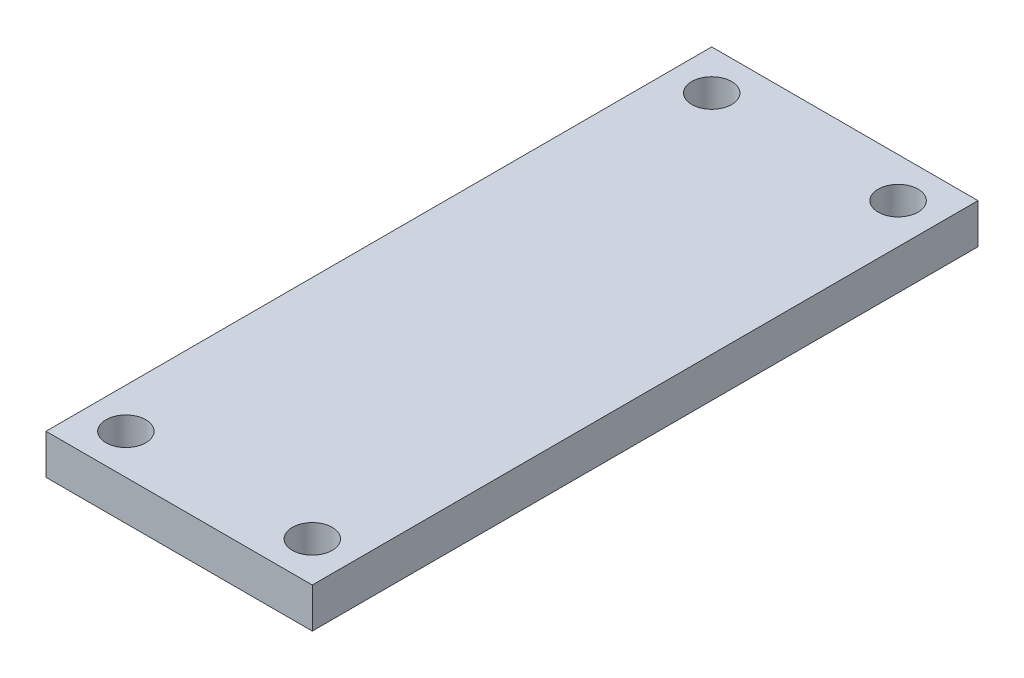
ISO-10303-21;
HEADER;
FILE_DESCRIPTION(('STEP AP214'),'2;1');
FILE_NAME('part.step','',(''),(''),'','','');
FILE_SCHEMA(('AUTOMOTIVE_DESIGN { 1 0 10303 214 1 1 1 1 }'));
ENDSEC;
DATA;
#1=APPLICATION_CONTEXT('core data for automotive mechanical design processes');
#2=APPLICATION_PROTOCOL_DEFINITION('international standard','automotive_design',2000,#1);
#3=PRODUCT_CONTEXT('',#1,'mechanical');
#4=PRODUCT('Part','Part','',(#3));
#5=PRODUCT_RELATED_PRODUCT_CATEGORY('part','',(#4));
#6=PRODUCT_DEFINITION_FORMATION('','',#4);
#7=PRODUCT_DEFINITION_CONTEXT('part definition',#1,'design');
#8=PRODUCT_DEFINITION('design','',#6,#7);
#9=PRODUCT_DEFINITION_SHAPE('','',#8);
#10=(LENGTH_UNIT() NAMED_UNIT(*) SI_UNIT(.MILLI.,.METRE.));
#11=(NAMED_UNIT(*) PLANE_ANGLE_UNIT() SI_UNIT($,.RADIAN.));
#12=(NAMED_UNIT(*) SI_UNIT($,.STERADIAN.) SOLID_ANGLE_UNIT());
#13=UNCERTAINTY_MEASURE_WITH_UNIT(LENGTH_MEASURE(1.E-05),#10,'distance_accuracy_value','');
#14=(GEOMETRIC_REPRESENTATION_CONTEXT(3) GLOBAL_UNCERTAINTY_ASSIGNED_CONTEXT((#13)) GLOBAL_UNIT_ASSIGNED_CONTEXT((#10,
#11,#12)) REPRESENTATION_CONTEXT('',''));
#15=CARTESIAN_POINT('',(0.,0.,0.));
#16=DIRECTION('',(0.,0.,1.));
#17=DIRECTION('',(1.,0.,0.));
#18=AXIS2_PLACEMENT_3D('',#15,#16,#17);
#19=CARTESIAN_POINT('',(-10.,1.5,25.));
#20=DIRECTION('',(0.,0.,-1.));
#21=DIRECTION('',(-1.,0.,0.));
#22=AXIS2_PLACEMENT_3D('',#19,#20,#21);
#23=PLANE('',#22);
#24=DIRECTION('',(1.,0.,0.));
#25=VECTOR('',#24,1.);
#26=CARTESIAN_POINT('',(-10.,-1.5,25.));
#27=LINE('',#26,#25);
#28=CARTESIAN_POINT('',(-10.,-1.5,25.));
#29=VERTEX_POINT('',#28);
#30=CARTESIAN_POINT('',(10.,-1.5,25.));
#31=VERTEX_POINT('',#30);
#32=EDGE_CURVE('E100',#29,#31,#27,.T.);
#33=ORIENTED_EDGE('',*,*,#32,.T.);
#34=DIRECTION('',(0.,-1.,0.));
#35=VECTOR('',#34,1.);
#36=CARTESIAN_POINT('',(10.,1.5,25.));
#37=LINE('',#36,#35);
#38=CARTESIAN_POINT('',(10.,1.5,25.));
#39=VERTEX_POINT('',#38);
#40=EDGE_CURVE('E11',#39,#31,#37,.T.);
#41=ORIENTED_EDGE('',*,*,#40,.F.);
#42=DIRECTION('',(1.,0.,0.));
#43=VECTOR('',#42,1.);
#44=CARTESIAN_POINT('',(-10.,1.5,25.));
#45=LINE('',#44,#43);
#46=CARTESIAN_POINT('',(-10.,1.5,25.));
#47=VERTEX_POINT('',#46);
#48=EDGE_CURVE('E86',#47,#39,#45,.T.);
#49=ORIENTED_EDGE('',*,*,#48,.F.);
#50=DIRECTION('',(0.,-1.,0.));
#51=VECTOR('',#50,1.);
#52=CARTESIAN_POINT('',(-10.,1.5,25.));
#53=LINE('',#52,#51);
#54=EDGE_CURVE('E53',#47,#29,#53,.T.);
#55=ORIENTED_EDGE('',*,*,#54,.T.);
#56=EDGE_LOOP('',(#33,#41,#49,#55));
#57=FACE_BOUND('',#56,.T.);
#58=ADVANCED_FACE('F37',(#57),#23,.F.);
#59=CARTESIAN_POINT('',(10.,1.5,25.));
#60=DIRECTION('',(-1.,0.,0.));
#61=DIRECTION('',(0.,0.,1.));
#62=AXIS2_PLACEMENT_3D('',#59,#60,#61);
#63=PLANE('',#62);
#64=DIRECTION('',(0.,0.,-1.));
#65=VECTOR('',#64,1.);
#66=CARTESIAN_POINT('',(10.,-1.5,25.));
#67=LINE('',#66,#65);
#68=CARTESIAN_POINT('',(10.,-1.5,-25.));
#69=VERTEX_POINT('',#68);
#70=EDGE_CURVE('E91',#31,#69,#67,.T.);
#71=ORIENTED_EDGE('',*,*,#70,.T.);
#72=DIRECTION('',(0.,-1.,0.));
#73=VECTOR('',#72,1.);
#74=CARTESIAN_POINT('',(10.,1.5,-25.));
#75=LINE('',#74,#73);
#76=CARTESIAN_POINT('',(10.,1.5,-25.));
#77=VERTEX_POINT('',#76);
#78=EDGE_CURVE('E45',#77,#69,#75,.T.);
#79=ORIENTED_EDGE('',*,*,#78,.F.);
#80=DIRECTION('',(0.,0.,-1.));
#81=VECTOR('',#80,1.);
#82=CARTESIAN_POINT('',(10.,1.5,25.));
#83=LINE('',#82,#81);
#84=EDGE_CURVE('E78',#39,#77,#83,.T.);
#85=ORIENTED_EDGE('',*,*,#84,.F.);
#86=ORIENTED_EDGE('',*,*,#40,.T.);
#87=EDGE_LOOP('',(#71,#79,#85,#86));
#88=FACE_BOUND('',#87,.T.);
#89=ADVANCED_FACE('F90',(#88),#63,.F.);
#90=CARTESIAN_POINT('',(-10.,1.5,-25.));
#91=DIRECTION('',(0.,0.,-1.));
#92=DIRECTION('',(-1.,0.,0.));
#93=AXIS2_PLACEMENT_3D('',#90,#91,#92);
#94=PLANE('',#93);
#95=DIRECTION('',(1.,0.,0.));
#96=VECTOR('',#95,1.);
#97=CARTESIAN_POINT('',(-10.,-1.5,-25.));
#98=LINE('',#97,#96);
#99=CARTESIAN_POINT('',(-10.,-1.5,-25.));
#100=VERTEX_POINT('',#99);
#101=EDGE_CURVE('E104',#100,#69,#98,.T.);
#102=ORIENTED_EDGE('',*,*,#101,.F.);
#103=DIRECTION('',(0.,-1.,0.));
#104=VECTOR('',#103,1.);
#105=CARTESIAN_POINT('',(-10.,1.5,-25.));
#106=LINE('',#105,#104);
#107=CARTESIAN_POINT('',(-10.,1.5,-25.));
#108=VERTEX_POINT('',#107);
#109=EDGE_CURVE('E67',#108,#100,#106,.T.);
#110=ORIENTED_EDGE('',*,*,#109,.F.);
#111=DIRECTION('',(1.,0.,0.));
#112=VECTOR('',#111,1.);
#113=CARTESIAN_POINT('',(-10.,1.5,-25.));
#114=LINE('',#113,#112);
#115=EDGE_CURVE('E85',#108,#77,#114,.T.);
#116=ORIENTED_EDGE('',*,*,#115,.T.);
#117=ORIENTED_EDGE('',*,*,#78,.T.);
#118=EDGE_LOOP('',(#102,#110,#116,#117));
#119=FACE_BOUND('',#118,.T.);
#120=ADVANCED_FACE('F94',(#119),#94,.T.);
#121=CARTESIAN_POINT('',(-10.,1.5,25.));
#122=DIRECTION('',(-1.,0.,0.));
#123=DIRECTION('',(0.,0.,1.));
#124=AXIS2_PLACEMENT_3D('',#121,#122,#123);
#125=PLANE('',#124);
#126=DIRECTION('',(0.,0.,-1.));
#127=VECTOR('',#126,1.);
#128=CARTESIAN_POINT('',(-10.,-1.5,25.));
#129=LINE('',#128,#127);
#130=EDGE_CURVE('E106',#29,#100,#129,.T.);
#131=ORIENTED_EDGE('',*,*,#130,.F.);
#132=ORIENTED_EDGE('',*,*,#54,.F.);
#133=DIRECTION('',(0.,0.,-1.));
#134=VECTOR('',#133,1.);
#135=CARTESIAN_POINT('',(-10.,1.5,25.));
#136=LINE('',#135,#134);
#137=EDGE_CURVE('E95',#47,#108,#136,.T.);
#138=ORIENTED_EDGE('',*,*,#137,.T.);
#139=ORIENTED_EDGE('',*,*,#109,.T.);
#140=EDGE_LOOP('',(#131,#132,#138,#139));
#141=FACE_BOUND('',#140,.T.);
#142=ADVANCED_FACE('F145',(#141),#125,.T.);
#143=CARTESIAN_POINT('',(0.,1.5,0.));
#144=DIRECTION('',(0.,1.,0.));
#145=DIRECTION('',(0.,0.,1.));
#146=AXIS2_PLACEMENT_3D('',#143,#144,#145);
#147=PLANE('',#146);
#148=CARTESIAN_POINT('',(-7.,1.5,-22.));
#149=DIRECTION('',(0.,1.,0.));
#150=DIRECTION('',(0.,0.,1.));
#151=AXIS2_PLACEMENT_3D('',#148,#149,#150);
#152=CIRCLE('',#151,1.5);
#153=CARTESIAN_POINT('',(-7.,1.5,-20.5));
#154=VERTEX_POINT('',#153);
#155=EDGE_CURVE('E118',#154,#154,#152,.T.);
#156=ORIENTED_EDGE('',*,*,#155,.F.);
#157=EDGE_LOOP('',(#156));
#158=FACE_BOUND('',#157,.T.);
#159=CARTESIAN_POINT('',(7.,1.5,-22.));
#160=DIRECTION('',(0.,1.,0.));
#161=DIRECTION('',(0.,0.,1.));
#162=AXIS2_PLACEMENT_3D('',#159,#160,#161);
#163=CIRCLE('',#162,1.5);
#164=CARTESIAN_POINT('',(7.,1.5,-20.5));
#165=VERTEX_POINT('',#164);
#166=EDGE_CURVE('E125',#165,#165,#163,.T.);
#167=ORIENTED_EDGE('',*,*,#166,.F.);
#168=EDGE_LOOP('',(#167));
#169=FACE_BOUND('',#168,.T.);
#170=CARTESIAN_POINT('',(7.,1.5,22.));
#171=DIRECTION('',(0.,1.,0.));
#172=DIRECTION('',(0.,0.,1.));
#173=AXIS2_PLACEMENT_3D('',#170,#171,#172);
#174=CIRCLE('',#173,1.5);
#175=CARTESIAN_POINT('',(7.,1.5,23.5));
#176=VERTEX_POINT('',#175);
#177=EDGE_CURVE('E117',#176,#176,#174,.T.);
#178=ORIENTED_EDGE('',*,*,#177,.F.);
#179=EDGE_LOOP('',(#178));
#180=FACE_BOUND('',#179,.T.);
#181=CARTESIAN_POINT('',(-7.,1.5,22.));
#182=DIRECTION('',(0.,1.,0.));
#183=DIRECTION('',(0.,0.,1.));
#184=AXIS2_PLACEMENT_3D('',#181,#182,#183);
#185=CIRCLE('',#184,1.5);
#186=CARTESIAN_POINT('',(-7.,1.5,23.5));
#187=VERTEX_POINT('',#186);
#188=EDGE_CURVE('E114',#187,#187,#185,.T.);
#189=ORIENTED_EDGE('',*,*,#188,.F.);
#190=EDGE_LOOP('',(#189));
#191=FACE_BOUND('',#190,.T.);
#192=ORIENTED_EDGE('',*,*,#48,.T.);
#193=ORIENTED_EDGE('',*,*,#84,.T.);
#194=ORIENTED_EDGE('',*,*,#115,.F.);
#195=ORIENTED_EDGE('',*,*,#137,.F.);
#196=EDGE_LOOP('',(#192,#193,#194,#195));
#197=FACE_BOUND('',#196,.T.);
#198=ADVANCED_FACE('F82',(#158,#169,#180,#191,#197),#147,.T.);
#199=CARTESIAN_POINT('',(0.,-1.5,0.));
#200=DIRECTION('',(0.,1.,0.));
#201=DIRECTION('',(0.,0.,1.));
#202=AXIS2_PLACEMENT_3D('',#199,#200,#201);
#203=PLANE('',#202);
#204=CARTESIAN_POINT('',(-7.,-1.5,-22.));
#205=DIRECTION('',(0.,1.,0.));
#206=DIRECTION('',(0.,0.,1.));
#207=AXIS2_PLACEMENT_3D('',#204,#205,#206);
#208=CIRCLE('',#207,1.5);
#209=CARTESIAN_POINT('',(-7.,-1.5,-20.5));
#210=VERTEX_POINT('',#209);
#211=EDGE_CURVE('E122',#210,#210,#208,.F.);
#212=ORIENTED_EDGE('',*,*,#211,.F.);
#213=EDGE_LOOP('',(#212));
#214=FACE_BOUND('',#213,.T.);
#215=CARTESIAN_POINT('',(7.,-1.5,-22.));
#216=DIRECTION('',(0.,1.,0.));
#217=DIRECTION('',(0.,0.,1.));
#218=AXIS2_PLACEMENT_3D('',#215,#216,#217);
#219=CIRCLE('',#218,1.5);
#220=CARTESIAN_POINT('',(7.,-1.5,-20.5));
#221=VERTEX_POINT('',#220);
#222=EDGE_CURVE('E121',#221,#221,#219,.F.);
#223=ORIENTED_EDGE('',*,*,#222,.F.);
#224=EDGE_LOOP('',(#223));
#225=FACE_BOUND('',#224,.T.);
#226=CARTESIAN_POINT('',(7.,-1.5,22.));
#227=DIRECTION('',(0.,1.,0.));
#228=DIRECTION('',(0.,0.,1.));
#229=AXIS2_PLACEMENT_3D('',#226,#227,#228);
#230=CIRCLE('',#229,1.5);
#231=CARTESIAN_POINT('',(7.,-1.5,23.5));
#232=VERTEX_POINT('',#231);
#233=EDGE_CURVE('E128',#232,#232,#230,.F.);
#234=ORIENTED_EDGE('',*,*,#233,.F.);
#235=EDGE_LOOP('',(#234));
#236=FACE_BOUND('',#235,.T.);
#237=CARTESIAN_POINT('',(-7.,-1.5,22.));
#238=DIRECTION('',(0.,1.,0.));
#239=DIRECTION('',(0.,0.,1.));
#240=AXIS2_PLACEMENT_3D('',#237,#238,#239);
#241=CIRCLE('',#240,1.5);
#242=CARTESIAN_POINT('',(-7.,-1.5,23.5));
#243=VERTEX_POINT('',#242);
#244=EDGE_CURVE('E102',#243,#243,#241,.F.);
#245=ORIENTED_EDGE('',*,*,#244,.F.);
#246=EDGE_LOOP('',(#245));
#247=FACE_BOUND('',#246,.T.);
#248=ORIENTED_EDGE('',*,*,#32,.F.);
#249=ORIENTED_EDGE('',*,*,#130,.T.);
#250=ORIENTED_EDGE('',*,*,#101,.T.);
#251=ORIENTED_EDGE('',*,*,#70,.F.);
#252=EDGE_LOOP('',(#248,#249,#250,#251));
#253=FACE_BOUND('',#252,.T.);
#254=ADVANCED_FACE('F138',(#214,#225,#236,#247,#253),#203,.F.);
#255=CARTESIAN_POINT('',(-7.,-1.501,22.));
#256=DIRECTION('',(0.,1.,0.));
#257=DIRECTION('',(0.,0.,1.));
#258=AXIS2_PLACEMENT_3D('',#255,#256,#257);
#259=CYLINDRICAL_SURFACE('',#258,1.5);
#260=CARTESIAN_POINT('',(-7.,1.5,23.5));
#261=CARTESIAN_POINT('',(-7.,1.46875,23.5));
#262=CARTESIAN_POINT('',(-7.,1.4375,23.5));
#263=CARTESIAN_POINT('',(-7.,1.375,23.5));
#264=CARTESIAN_POINT('',(-7.,1.34375,23.5));
#265=CARTESIAN_POINT('',(-7.,1.28125,23.5));
#266=CARTESIAN_POINT('',(-7.,1.25,23.5));
#267=CARTESIAN_POINT('',(-7.,1.1875,23.5));
#268=CARTESIAN_POINT('',(-7.,1.15625,23.5));
#269=CARTESIAN_POINT('',(-7.,1.09375,23.5));
#270=CARTESIAN_POINT('',(-7.,1.0625,23.5));
#271=CARTESIAN_POINT('',(-7.,1.,23.5));
#272=CARTESIAN_POINT('',(-7.,0.96875,23.5));
#273=CARTESIAN_POINT('',(-7.,0.90625,23.5));
#274=CARTESIAN_POINT('',(-7.,0.874999999999999,23.5));
#275=CARTESIAN_POINT('',(-7.,0.8125,23.5));
#276=CARTESIAN_POINT('',(-7.,0.78125,23.5));
#277=CARTESIAN_POINT('',(-7.,0.71875,23.5));
#278=CARTESIAN_POINT('',(-7.,0.6875,23.5));
#279=CARTESIAN_POINT('',(-7.,0.625,23.5));
#280=CARTESIAN_POINT('',(-7.,0.59375,23.5));
#281=CARTESIAN_POINT('',(-7.,0.53125,23.5));
#282=CARTESIAN_POINT('',(-7.,0.5,23.5));
#283=CARTESIAN_POINT('',(-7.,0.4375,23.5));
#284=CARTESIAN_POINT('',(-7.,0.40625,23.5));
#285=CARTESIAN_POINT('',(-7.,0.34375,23.5));
#286=CARTESIAN_POINT('',(-7.,0.3125,23.5));
#287=CARTESIAN_POINT('',(-7.,0.25,23.5));
#288=CARTESIAN_POINT('',(-7.,0.21875,23.5));
#289=CARTESIAN_POINT('',(-7.,0.15625,23.5));
#290=CARTESIAN_POINT('',(-7.,0.125,23.5));
#291=CARTESIAN_POINT('',(-7.,0.0624999999999998,23.5));
#292=CARTESIAN_POINT('',(-7.,0.0312499999999998,23.5));
#293=CARTESIAN_POINT('',(-7.,-0.0312500000000002,23.5));
#294=CARTESIAN_POINT('',(-7.,-0.0625000000000003,23.5));
#295=CARTESIAN_POINT('',(-7.,-0.125,23.5));
#296=CARTESIAN_POINT('',(-7.,-0.15625,23.5));
#297=CARTESIAN_POINT('',(-7.,-0.21875,23.5));
#298=CARTESIAN_POINT('',(-7.,-0.25,23.5));
#299=CARTESIAN_POINT('',(-7.,-0.3125,23.5));
#300=CARTESIAN_POINT('',(-7.,-0.34375,23.5));
#301=CARTESIAN_POINT('',(-7.,-0.40625,23.5));
#302=CARTESIAN_POINT('',(-7.,-0.4375,23.5));
#303=CARTESIAN_POINT('',(-7.,-0.5,23.5));
#304=CARTESIAN_POINT('',(-7.,-0.53125,23.5));
#305=CARTESIAN_POINT('',(-7.,-0.59375,23.5));
#306=CARTESIAN_POINT('',(-7.,-0.625,23.5));
#307=CARTESIAN_POINT('',(-7.,-0.6875,23.5));
#308=CARTESIAN_POINT('',(-7.,-0.71875,23.5));
#309=CARTESIAN_POINT('',(-7.,-0.78125,23.5));
#310=CARTESIAN_POINT('',(-7.,-0.8125,23.5));
#311=CARTESIAN_POINT('',(-7.,-0.875,23.5));
#312=CARTESIAN_POINT('',(-7.,-0.90625,23.5));
#313=CARTESIAN_POINT('',(-7.,-0.96875,23.5));
#314=CARTESIAN_POINT('',(-7.,-1.,23.5));
#315=CARTESIAN_POINT('',(-7.,-1.0625,23.5));
#316=CARTESIAN_POINT('',(-7.,-1.09375,23.5));
#317=CARTESIAN_POINT('',(-7.,-1.15625,23.5));
#318=CARTESIAN_POINT('',(-7.,-1.1875,23.5));
#319=CARTESIAN_POINT('',(-7.,-1.25,23.5));
#320=CARTESIAN_POINT('',(-7.,-1.28125,23.5));
#321=CARTESIAN_POINT('',(-7.,-1.34375,23.5));
#322=CARTESIAN_POINT('',(-7.,-1.375,23.5));
#323=CARTESIAN_POINT('',(-7.,-1.4375,23.5));
#324=CARTESIAN_POINT('',(-7.,-1.46875,23.5));
#325=CARTESIAN_POINT('',(-7.,-1.5,23.5));
#326=B_SPLINE_CURVE_WITH_KNOTS('',3,(#260,#261,#262,#263,#264,#265,#266,#267,#268,#269,#270,
#271,#272,#273,#274,#275,#276,#277,#278,#279,#280,#281,#282,#283,#284,#285,#286,#287,#288,#289,
#290,#291,#292,#293,#294,#295,#296,#297,#298,#299,#300,#301,#302,#303,#304,#305,#306,#307,#308,
#309,#310,#311,#312,#313,#314,#315,#316,#317,#318,#319,#320,#321,#322,#323,#324,#325),
.UNSPECIFIED.,.F.,.F.,(4,2,2,2,2,2,2,2,2,2,2,2,2,2,2,2,2,2,2,2,2,2,2,2,2,2,2,2,2,2,2,2,4),(0.,
0.0937500000000001,0.1875,0.28125,0.375,0.46875,0.5625,0.65625,0.75,0.84375,0.9375,1.03125,
1.125,1.21875,1.3125,1.40625,1.5,1.59375,1.6875,1.78125,1.875,1.96875,2.0625,2.15625,2.25,
2.34375,2.4375,2.53125,2.625,2.71875,2.8125,2.90625,3.),.UNSPECIFIED.);
#327=EDGE_CURVE('BSEAM141',#187,#243,#326,.T.);
#328=ORIENTED_EDGE('',*,*,#188,.T.);
#329=ORIENTED_EDGE('',*,*,#244,.T.);
#330=ORIENTED_EDGE('',*,*,#327,.T.);
#331=ORIENTED_EDGE('',*,*,#327,.F.);
#332=EDGE_LOOP('',(#328,#330,#329,#331));
#333=FACE_BOUND('',#332,.T.);
#334=ADVANCED_FACE('F141',(#333),#259,.F.);
#335=CARTESIAN_POINT('',(7.,-1.501,22.));
#336=DIRECTION('',(0.,1.,0.));
#337=DIRECTION('',(0.,0.,1.));
#338=AXIS2_PLACEMENT_3D('',#335,#336,#337);
#339=CYLINDRICAL_SURFACE('',#338,1.5);
#340=CARTESIAN_POINT('',(7.,1.5,23.5));
#341=CARTESIAN_POINT('',(7.,1.46875,23.5));
#342=CARTESIAN_POINT('',(7.,1.4375,23.5));
#343=CARTESIAN_POINT('',(7.,1.375,23.5));
#344=CARTESIAN_POINT('',(7.,1.34375,23.5));
#345=CARTESIAN_POINT('',(7.,1.28125,23.5));
#346=CARTESIAN_POINT('',(7.,1.25,23.5));
#347=CARTESIAN_POINT('',(7.,1.1875,23.5));
#348=CARTESIAN_POINT('',(7.,1.15625,23.5));
#349=CARTESIAN_POINT('',(7.,1.09375,23.5));
#350=CARTESIAN_POINT('',(7.,1.0625,23.5));
#351=CARTESIAN_POINT('',(7.,1.,23.5));
#352=CARTESIAN_POINT('',(7.,0.96875,23.5));
#353=CARTESIAN_POINT('',(7.,0.90625,23.5));
#354=CARTESIAN_POINT('',(7.,0.874999999999999,23.5));
#355=CARTESIAN_POINT('',(7.,0.8125,23.5));
#356=CARTESIAN_POINT('',(7.,0.78125,23.5));
#357=CARTESIAN_POINT('',(7.,0.71875,23.5));
#358=CARTESIAN_POINT('',(7.,0.6875,23.5));
#359=CARTESIAN_POINT('',(7.,0.625,23.5));
#360=CARTESIAN_POINT('',(7.,0.59375,23.5));
#361=CARTESIAN_POINT('',(7.,0.53125,23.5));
#362=CARTESIAN_POINT('',(7.,0.5,23.5));
#363=CARTESIAN_POINT('',(7.,0.4375,23.5));
#364=CARTESIAN_POINT('',(7.,0.40625,23.5));
#365=CARTESIAN_POINT('',(7.,0.34375,23.5));
#366=CARTESIAN_POINT('',(7.,0.3125,23.5));
#367=CARTESIAN_POINT('',(7.,0.25,23.5));
#368=CARTESIAN_POINT('',(7.,0.21875,23.5));
#369=CARTESIAN_POINT('',(7.,0.15625,23.5));
#370=CARTESIAN_POINT('',(7.,0.125,23.5));
#371=CARTESIAN_POINT('',(7.,0.0624999999999998,23.5));
#372=CARTESIAN_POINT('',(7.,0.0312499999999998,23.5));
#373=CARTESIAN_POINT('',(7.,-0.0312500000000002,23.5));
#374=CARTESIAN_POINT('',(7.,-0.0625000000000003,23.5));
#375=CARTESIAN_POINT('',(7.,-0.125,23.5));
#376=CARTESIAN_POINT('',(7.,-0.15625,23.5));
#377=CARTESIAN_POINT('',(7.,-0.21875,23.5));
#378=CARTESIAN_POINT('',(7.,-0.25,23.5));
#379=CARTESIAN_POINT('',(7.,-0.3125,23.5));
#380=CARTESIAN_POINT('',(7.,-0.34375,23.5));
#381=CARTESIAN_POINT('',(7.,-0.40625,23.5));
#382=CARTESIAN_POINT('',(7.,-0.4375,23.5));
#383=CARTESIAN_POINT('',(7.,-0.5,23.5));
#384=CARTESIAN_POINT('',(7.,-0.53125,23.5));
#385=CARTESIAN_POINT('',(7.,-0.59375,23.5));
#386=CARTESIAN_POINT('',(7.,-0.625,23.5));
#387=CARTESIAN_POINT('',(7.,-0.6875,23.5));
#388=CARTESIAN_POINT('',(7.,-0.71875,23.5));
#389=CARTESIAN_POINT('',(7.,-0.78125,23.5));
#390=CARTESIAN_POINT('',(7.,-0.8125,23.5));
#391=CARTESIAN_POINT('',(7.,-0.875,23.5));
#392=CARTESIAN_POINT('',(7.,-0.90625,23.5));
#393=CARTESIAN_POINT('',(7.,-0.96875,23.5));
#394=CARTESIAN_POINT('',(7.,-1.,23.5));
#395=CARTESIAN_POINT('',(7.,-1.0625,23.5));
#396=CARTESIAN_POINT('',(7.,-1.09375,23.5));
#397=CARTESIAN_POINT('',(7.,-1.15625,23.5));
#398=CARTESIAN_POINT('',(7.,-1.1875,23.5));
#399=CARTESIAN_POINT('',(7.,-1.25,23.5));
#400=CARTESIAN_POINT('',(7.,-1.28125,23.5));
#401=CARTESIAN_POINT('',(7.,-1.34375,23.5));
#402=CARTESIAN_POINT('',(7.,-1.375,23.5));
#403=CARTESIAN_POINT('',(7.,-1.4375,23.5));
#404=CARTESIAN_POINT('',(7.,-1.46875,23.5));
#405=CARTESIAN_POINT('',(7.,-1.5,23.5));
#406=B_SPLINE_CURVE_WITH_KNOTS('',3,(#340,#341,#342,#343,#344,#345,#346,#347,#348,#349,#350,
#351,#352,#353,#354,#355,#356,#357,#358,#359,#360,#361,#362,#363,#364,#365,#366,#367,#368,#369,
#370,#371,#372,#373,#374,#375,#376,#377,#378,#379,#380,#381,#382,#383,#384,#385,#386,#387,#388,
#389,#390,#391,#392,#393,#394,#395,#396,#397,#398,#399,#400,#401,#402,#403,#404,#405),
.UNSPECIFIED.,.F.,.F.,(4,2,2,2,2,2,2,2,2,2,2,2,2,2,2,2,2,2,2,2,2,2,2,2,2,2,2,2,2,2,2,2,4),(0.,
0.0937500000000001,0.1875,0.28125,0.375,0.46875,0.5625,0.65625,0.75,0.84375,0.9375,1.03125,
1.125,1.21875,1.3125,1.40625,1.5,1.59375,1.6875,1.78125,1.875,1.96875,2.0625,2.15625,2.25,
2.34375,2.4375,2.53125,2.625,2.71875,2.8125,2.90625,3.),.UNSPECIFIED.);
#407=EDGE_CURVE('BSEAM136',#176,#232,#406,.T.);
#408=ORIENTED_EDGE('',*,*,#177,.T.);
#409=ORIENTED_EDGE('',*,*,#233,.T.);
#410=ORIENTED_EDGE('',*,*,#407,.T.);
#411=ORIENTED_EDGE('',*,*,#407,.F.);
#412=EDGE_LOOP('',(#408,#410,#409,#411));
#413=FACE_BOUND('',#412,.T.);
#414=ADVANCED_FACE('F136',(#413),#339,.F.);
#415=CARTESIAN_POINT('',(7.,-1.501,-22.));
#416=DIRECTION('',(0.,1.,0.));
#417=DIRECTION('',(0.,0.,1.));
#418=AXIS2_PLACEMENT_3D('',#415,#416,#417);
#419=CYLINDRICAL_SURFACE('',#418,1.5);
#420=CARTESIAN_POINT('',(7.,1.5,-20.5));
#421=CARTESIAN_POINT('',(7.,1.46875,-20.5));
#422=CARTESIAN_POINT('',(7.,1.4375,-20.5));
#423=CARTESIAN_POINT('',(7.,1.375,-20.5));
#424=CARTESIAN_POINT('',(7.,1.34375,-20.5));
#425=CARTESIAN_POINT('',(7.,1.28125,-20.5));
#426=CARTESIAN_POINT('',(7.,1.25,-20.5));
#427=CARTESIAN_POINT('',(7.,1.1875,-20.5));
#428=CARTESIAN_POINT('',(7.,1.15625,-20.5));
#429=CARTESIAN_POINT('',(7.,1.09375,-20.5));
#430=CARTESIAN_POINT('',(7.,1.0625,-20.5));
#431=CARTESIAN_POINT('',(7.,1.,-20.5));
#432=CARTESIAN_POINT('',(7.,0.96875,-20.5));
#433=CARTESIAN_POINT('',(7.,0.90625,-20.5));
#434=CARTESIAN_POINT('',(7.,0.874999999999999,-20.5));
#435=CARTESIAN_POINT('',(7.,0.8125,-20.5));
#436=CARTESIAN_POINT('',(7.,0.78125,-20.5));
#437=CARTESIAN_POINT('',(7.,0.71875,-20.5));
#438=CARTESIAN_POINT('',(7.,0.6875,-20.5));
#439=CARTESIAN_POINT('',(7.,0.625,-20.5));
#440=CARTESIAN_POINT('',(7.,0.59375,-20.5));
#441=CARTESIAN_POINT('',(7.,0.53125,-20.5));
#442=CARTESIAN_POINT('',(7.,0.5,-20.5));
#443=CARTESIAN_POINT('',(7.,0.4375,-20.5));
#444=CARTESIAN_POINT('',(7.,0.40625,-20.5));
#445=CARTESIAN_POINT('',(7.,0.34375,-20.5));
#446=CARTESIAN_POINT('',(7.,0.3125,-20.5));
#447=CARTESIAN_POINT('',(7.,0.25,-20.5));
#448=CARTESIAN_POINT('',(7.,0.21875,-20.5));
#449=CARTESIAN_POINT('',(7.,0.15625,-20.5));
#450=CARTESIAN_POINT('',(7.,0.125,-20.5));
#451=CARTESIAN_POINT('',(7.,0.0624999999999998,-20.5));
#452=CARTESIAN_POINT('',(7.,0.0312499999999998,-20.5));
#453=CARTESIAN_POINT('',(7.,-0.0312500000000002,-20.5));
#454=CARTESIAN_POINT('',(7.,-0.0625000000000003,-20.5));
#455=CARTESIAN_POINT('',(7.,-0.125,-20.5));
#456=CARTESIAN_POINT('',(7.,-0.15625,-20.5));
#457=CARTESIAN_POINT('',(7.,-0.21875,-20.5));
#458=CARTESIAN_POINT('',(7.,-0.25,-20.5));
#459=CARTESIAN_POINT('',(7.,-0.3125,-20.5));
#460=CARTESIAN_POINT('',(7.,-0.34375,-20.5));
#461=CARTESIAN_POINT('',(7.,-0.40625,-20.5));
#462=CARTESIAN_POINT('',(7.,-0.4375,-20.5));
#463=CARTESIAN_POINT('',(7.,-0.5,-20.5));
#464=CARTESIAN_POINT('',(7.,-0.53125,-20.5));
#465=CARTESIAN_POINT('',(7.,-0.59375,-20.5));
#466=CARTESIAN_POINT('',(7.,-0.625,-20.5));
#467=CARTESIAN_POINT('',(7.,-0.6875,-20.5));
#468=CARTESIAN_POINT('',(7.,-0.71875,-20.5));
#469=CARTESIAN_POINT('',(7.,-0.78125,-20.5));
#470=CARTESIAN_POINT('',(7.,-0.8125,-20.5));
#471=CARTESIAN_POINT('',(7.,-0.875,-20.5));
#472=CARTESIAN_POINT('',(7.,-0.90625,-20.5));
#473=CARTESIAN_POINT('',(7.,-0.96875,-20.5));
#474=CARTESIAN_POINT('',(7.,-1.,-20.5));
#475=CARTESIAN_POINT('',(7.,-1.0625,-20.5));
#476=CARTESIAN_POINT('',(7.,-1.09375,-20.5));
#477=CARTESIAN_POINT('',(7.,-1.15625,-20.5));
#478=CARTESIAN_POINT('',(7.,-1.1875,-20.5));
#479=CARTESIAN_POINT('',(7.,-1.25,-20.5));
#480=CARTESIAN_POINT('',(7.,-1.28125,-20.5));
#481=CARTESIAN_POINT('',(7.,-1.34375,-20.5));
#482=CARTESIAN_POINT('',(7.,-1.375,-20.5));
#483=CARTESIAN_POINT('',(7.,-1.4375,-20.5));
#484=CARTESIAN_POINT('',(7.,-1.46875,-20.5));
#485=CARTESIAN_POINT('',(7.,-1.5,-20.5));
#486=B_SPLINE_CURVE_WITH_KNOTS('',3,(#420,#421,#422,#423,#424,#425,#426,#427,#428,#429,#430,
#431,#432,#433,#434,#435,#436,#437,#438,#439,#440,#441,#442,#443,#444,#445,#446,#447,#448,#449,
#450,#451,#452,#453,#454,#455,#456,#457,#458,#459,#460,#461,#462,#463,#464,#465,#466,#467,#468,
#469,#470,#471,#472,#473,#474,#475,#476,#477,#478,#479,#480,#481,#482,#483,#484,#485),
.UNSPECIFIED.,.F.,.F.,(4,2,2,2,2,2,2,2,2,2,2,2,2,2,2,2,2,2,2,2,2,2,2,2,2,2,2,2,2,2,2,2,4),(0.,
0.0937500000000001,0.1875,0.28125,0.375,0.46875,0.5625,0.65625,0.75,0.84375,0.9375,1.03125,
1.125,1.21875,1.3125,1.40625,1.5,1.59375,1.6875,1.78125,1.875,1.96875,2.0625,2.15625,2.25,
2.34375,2.4375,2.53125,2.625,2.71875,2.8125,2.90625,3.),.UNSPECIFIED.);
#487=EDGE_CURVE('BSEAM204',#165,#221,#486,.T.);
#488=ORIENTED_EDGE('',*,*,#166,.T.);
#489=ORIENTED_EDGE('',*,*,#222,.T.);
#490=ORIENTED_EDGE('',*,*,#487,.T.);
#491=ORIENTED_EDGE('',*,*,#487,.F.);
#492=EDGE_LOOP('',(#488,#490,#489,#491));
#493=FACE_BOUND('',#492,.T.);
#494=ADVANCED_FACE('F204',(#493),#419,.F.);
#495=CARTESIAN_POINT('',(-7.,-1.501,-22.));
#496=DIRECTION('',(0.,1.,0.));
#497=DIRECTION('',(0.,0.,1.));
#498=AXIS2_PLACEMENT_3D('',#495,#496,#497);
#499=CYLINDRICAL_SURFACE('',#498,1.5);
#500=CARTESIAN_POINT('',(-7.,1.5,-20.5));
#501=CARTESIAN_POINT('',(-7.,1.46875,-20.5));
#502=CARTESIAN_POINT('',(-7.,1.4375,-20.5));
#503=CARTESIAN_POINT('',(-7.,1.375,-20.5));
#504=CARTESIAN_POINT('',(-7.,1.34375,-20.5));
#505=CARTESIAN_POINT('',(-7.,1.28125,-20.5));
#506=CARTESIAN_POINT('',(-7.,1.25,-20.5));
#507=CARTESIAN_POINT('',(-7.,1.1875,-20.5));
#508=CARTESIAN_POINT('',(-7.,1.15625,-20.5));
#509=CARTESIAN_POINT('',(-7.,1.09375,-20.5));
#510=CARTESIAN_POINT('',(-7.,1.0625,-20.5));
#511=CARTESIAN_POINT('',(-7.,1.,-20.5));
#512=CARTESIAN_POINT('',(-7.,0.96875,-20.5));
#513=CARTESIAN_POINT('',(-7.,0.90625,-20.5));
#514=CARTESIAN_POINT('',(-7.,0.874999999999999,-20.5));
#515=CARTESIAN_POINT('',(-7.,0.8125,-20.5));
#516=CARTESIAN_POINT('',(-7.,0.78125,-20.5));
#517=CARTESIAN_POINT('',(-7.,0.71875,-20.5));
#518=CARTESIAN_POINT('',(-7.,0.6875,-20.5));
#519=CARTESIAN_POINT('',(-7.,0.625,-20.5));
#520=CARTESIAN_POINT('',(-7.,0.59375,-20.5));
#521=CARTESIAN_POINT('',(-7.,0.53125,-20.5));
#522=CARTESIAN_POINT('',(-7.,0.5,-20.5));
#523=CARTESIAN_POINT('',(-7.,0.4375,-20.5));
#524=CARTESIAN_POINT('',(-7.,0.40625,-20.5));
#525=CARTESIAN_POINT('',(-7.,0.34375,-20.5));
#526=CARTESIAN_POINT('',(-7.,0.3125,-20.5));
#527=CARTESIAN_POINT('',(-7.,0.25,-20.5));
#528=CARTESIAN_POINT('',(-7.,0.21875,-20.5));
#529=CARTESIAN_POINT('',(-7.,0.15625,-20.5));
#530=CARTESIAN_POINT('',(-7.,0.125,-20.5));
#531=CARTESIAN_POINT('',(-7.,0.0624999999999998,-20.5));
#532=CARTESIAN_POINT('',(-7.,0.0312499999999998,-20.5));
#533=CARTESIAN_POINT('',(-7.,-0.0312500000000002,-20.5));
#534=CARTESIAN_POINT('',(-7.,-0.0625000000000003,-20.5));
#535=CARTESIAN_POINT('',(-7.,-0.125,-20.5));
#536=CARTESIAN_POINT('',(-7.,-0.15625,-20.5));
#537=CARTESIAN_POINT('',(-7.,-0.21875,-20.5));
#538=CARTESIAN_POINT('',(-7.,-0.25,-20.5));
#539=CARTESIAN_POINT('',(-7.,-0.3125,-20.5));
#540=CARTESIAN_POINT('',(-7.,-0.34375,-20.5));
#541=CARTESIAN_POINT('',(-7.,-0.40625,-20.5));
#542=CARTESIAN_POINT('',(-7.,-0.4375,-20.5));
#543=CARTESIAN_POINT('',(-7.,-0.5,-20.5));
#544=CARTESIAN_POINT('',(-7.,-0.53125,-20.5));
#545=CARTESIAN_POINT('',(-7.,-0.59375,-20.5));
#546=CARTESIAN_POINT('',(-7.,-0.625,-20.5));
#547=CARTESIAN_POINT('',(-7.,-0.6875,-20.5));
#548=CARTESIAN_POINT('',(-7.,-0.71875,-20.5));
#549=CARTESIAN_POINT('',(-7.,-0.78125,-20.5));
#550=CARTESIAN_POINT('',(-7.,-0.8125,-20.5));
#551=CARTESIAN_POINT('',(-7.,-0.875,-20.5));
#552=CARTESIAN_POINT('',(-7.,-0.90625,-20.5));
#553=CARTESIAN_POINT('',(-7.,-0.96875,-20.5));
#554=CARTESIAN_POINT('',(-7.,-1.,-20.5));
#555=CARTESIAN_POINT('',(-7.,-1.0625,-20.5));
#556=CARTESIAN_POINT('',(-7.,-1.09375,-20.5));
#557=CARTESIAN_POINT('',(-7.,-1.15625,-20.5));
#558=CARTESIAN_POINT('',(-7.,-1.1875,-20.5));
#559=CARTESIAN_POINT('',(-7.,-1.25,-20.5));
#560=CARTESIAN_POINT('',(-7.,-1.28125,-20.5));
#561=CARTESIAN_POINT('',(-7.,-1.34375,-20.5));
#562=CARTESIAN_POINT('',(-7.,-1.375,-20.5));
#563=CARTESIAN_POINT('',(-7.,-1.4375,-20.5));
#564=CARTESIAN_POINT('',(-7.,-1.46875,-20.5));
#565=CARTESIAN_POINT('',(-7.,-1.5,-20.5));
#566=B_SPLINE_CURVE_WITH_KNOTS('',3,(#500,#501,#502,#503,#504,#505,#506,#507,#508,#509,#510,
#511,#512,#513,#514,#515,#516,#517,#518,#519,#520,#521,#522,#523,#524,#525,#526,#527,#528,#529,
#530,#531,#532,#533,#534,#535,#536,#537,#538,#539,#540,#541,#542,#543,#544,#545,#546,#547,#548,
#549,#550,#551,#552,#553,#554,#555,#556,#557,#558,#559,#560,#561,#562,#563,#564,#565),
.UNSPECIFIED.,.F.,.F.,(4,2,2,2,2,2,2,2,2,2,2,2,2,2,2,2,2,2,2,2,2,2,2,2,2,2,2,2,2,2,2,2,4),(0.,
0.0937500000000001,0.1875,0.28125,0.375,0.46875,0.5625,0.65625,0.75,0.84375,0.9375,1.03125,
1.125,1.21875,1.3125,1.40625,1.5,1.59375,1.6875,1.78125,1.875,1.96875,2.0625,2.15625,2.25,
2.34375,2.4375,2.53125,2.625,2.71875,2.8125,2.90625,3.),.UNSPECIFIED.);
#567=EDGE_CURVE('BSEAM215',#154,#210,#566,.T.);
#568=ORIENTED_EDGE('',*,*,#155,.T.);
#569=ORIENTED_EDGE('',*,*,#211,.T.);
#570=ORIENTED_EDGE('',*,*,#567,.T.);
#571=ORIENTED_EDGE('',*,*,#567,.F.);
#572=EDGE_LOOP('',(#568,#570,#569,#571));
#573=FACE_BOUND('',#572,.T.);
#574=ADVANCED_FACE('F215',(#573),#499,.F.);
#575=CLOSED_SHELL('',(#58,#89,#120,#142,#198,#254,#334,#414,#494,#574));
#576=MANIFOLD_SOLID_BREP('B2',#575);
#577=ADVANCED_BREP_SHAPE_REPRESENTATION('',(#18,#576),#14);
#578=SHAPE_DEFINITION_REPRESENTATION(#9,#577);
ENDSEC;
END-ISO-10303-21;
